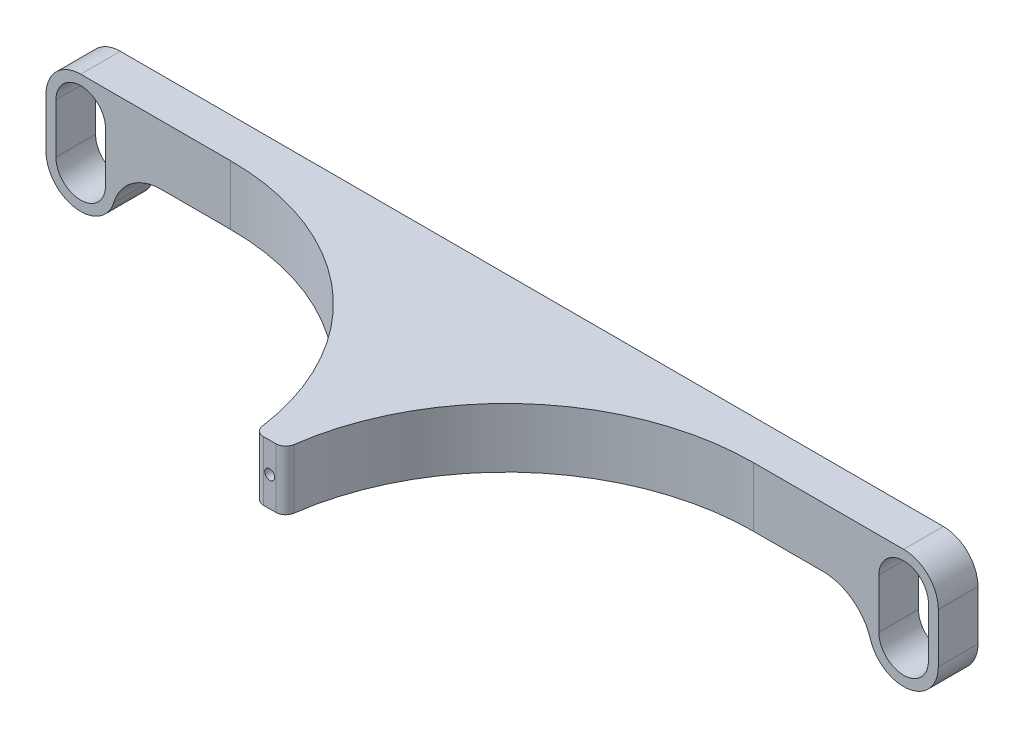
ISO-10303-21;
HEADER;
FILE_DESCRIPTION(('STEP AP214'),'2;1');
FILE_NAME('part.step','',(''),(''),'','','');
FILE_SCHEMA(('AUTOMOTIVE_DESIGN { 1 0 10303 214 1 1 1 1 }'));
ENDSEC;
DATA;
#1=APPLICATION_CONTEXT('core data for automotive mechanical design processes');
#2=APPLICATION_PROTOCOL_DEFINITION('international standard','automotive_design',2000,#1);
#3=PRODUCT_CONTEXT('',#1,'mechanical');
#4=PRODUCT('Part','Part','',(#3));
#5=PRODUCT_RELATED_PRODUCT_CATEGORY('part','',(#4));
#6=PRODUCT_DEFINITION_FORMATION('','',#4);
#7=PRODUCT_DEFINITION_CONTEXT('part definition',#1,'design');
#8=PRODUCT_DEFINITION('design','',#6,#7);
#9=PRODUCT_DEFINITION_SHAPE('','',#8);
#10=(LENGTH_UNIT() NAMED_UNIT(*) SI_UNIT(.MILLI.,.METRE.));
#11=(NAMED_UNIT(*) PLANE_ANGLE_UNIT() SI_UNIT($,.RADIAN.));
#12=(NAMED_UNIT(*) SI_UNIT($,.STERADIAN.) SOLID_ANGLE_UNIT());
#13=UNCERTAINTY_MEASURE_WITH_UNIT(LENGTH_MEASURE(1.E-05),#10,'distance_accuracy_value','');
#14=(GEOMETRIC_REPRESENTATION_CONTEXT(3) GLOBAL_UNCERTAINTY_ASSIGNED_CONTEXT((#13)) GLOBAL_UNIT_ASSIGNED_CONTEXT((#10,
#11,#12)) REPRESENTATION_CONTEXT('',''));
#15=CARTESIAN_POINT('',(0.,0.,0.));
#16=DIRECTION('',(0.,0.,1.));
#17=DIRECTION('',(1.,0.,0.));
#18=AXIS2_PLACEMENT_3D('',#15,#16,#17);
#19=CARTESIAN_POINT('',(0.,0.,4.));
#20=DIRECTION('',(0.,0.,1.));
#21=DIRECTION('',(1.,0.,0.));
#22=AXIS2_PLACEMENT_3D('',#19,#20,#21);
#23=PLANE('',#22);
#24=DIRECTION('',(1.,0.,0.));
#25=VECTOR('',#24,1.);
#26=CARTESIAN_POINT('',(0.,-6.,4.));
#27=LINE('',#26,#25);
#28=CARTESIAN_POINT('',(-33.375961595364,-6.,4.));
#29=VERTEX_POINT('',#28);
#30=CARTESIAN_POINT('',(-26.3685825892832,-6.,4.));
#31=VERTEX_POINT('',#30);
#32=EDGE_CURVE('E226',#29,#31,#27,.T.);
#33=ORIENTED_EDGE('',*,*,#32,.T.);
#34=DIRECTION('',(0.,1.,0.));
#35=VECTOR('',#34,1.);
#36=CARTESIAN_POINT('',(-26.3685825892832,0.,4.));
#37=LINE('',#36,#35);
#38=CARTESIAN_POINT('',(-26.3685825892832,0.,4.));
#39=VERTEX_POINT('',#38);
#40=EDGE_CURVE('E363',#31,#39,#37,.T.);
#41=ORIENTED_EDGE('',*,*,#40,.T.);
#42=DIRECTION('',(1.,0.,0.));
#43=VECTOR('',#42,1.);
#44=CARTESIAN_POINT('',(0.,0.,4.));
#45=LINE('',#44,#43);
#46=CARTESIAN_POINT('',(-41.5,0.,4.));
#47=VERTEX_POINT('',#46);
#48=EDGE_CURVE('E240',#47,#39,#45,.T.);
#49=ORIENTED_EDGE('',*,*,#48,.F.);
#50=CARTESIAN_POINT('',(-41.5,-3.5,4.));
#51=DIRECTION('',(0.,0.,1.));
#52=DIRECTION('',(1.,0.,0.));
#53=AXIS2_PLACEMENT_3D('',#50,#51,#52);
#54=CIRCLE('',#53,3.5);
#55=CARTESIAN_POINT('',(-45.,-3.5,4.));
#56=VERTEX_POINT('',#55);
#57=EDGE_CURVE('E239',#47,#56,#54,.T.);
#58=ORIENTED_EDGE('',*,*,#57,.T.);
#59=DIRECTION('',(0.,-1.,0.));
#60=VECTOR('',#59,1.);
#61=CARTESIAN_POINT('',(-45.,0.,4.));
#62=LINE('',#61,#60);
#63=CARTESIAN_POINT('',(-45.,-8.5,4.));
#64=VERTEX_POINT('',#63);
#65=EDGE_CURVE('E245',#56,#64,#62,.T.);
#66=ORIENTED_EDGE('',*,*,#65,.T.);
#67=CARTESIAN_POINT('',(-41.5,-8.5,4.));
#68=DIRECTION('',(0.,0.,1.));
#69=DIRECTION('',(1.,0.,0.));
#70=AXIS2_PLACEMENT_3D('',#67,#68,#69);
#71=CIRCLE('',#70,3.5);
#72=CARTESIAN_POINT('',(-38.1548077157381,-9.52941176470588,4.));
#73=VERTEX_POINT('',#72);
#74=EDGE_CURVE('E242',#64,#73,#71,.T.);
#75=ORIENTED_EDGE('',*,*,#74,.T.);
#76=CARTESIAN_POINT('',(-33.375961595364,-11.,4.));
#77=DIRECTION('',(0.,0.,1.));
#78=DIRECTION('',(1.,0.,0.));
#79=AXIS2_PLACEMENT_3D('',#76,#77,#78);
#80=CIRCLE('',#79,5.);
#81=EDGE_CURVE('E357',#73,#29,#80,.F.);
#82=ORIENTED_EDGE('',*,*,#81,.T.);
#83=EDGE_LOOP('',(#33,#41,#49,#58,#66,#75,#82));
#84=FACE_BOUND('',#83,.T.);
#85=CARTESIAN_POINT('',(-41.5,-8.5,4.));
#86=DIRECTION('',(0.,0.,1.));
#87=DIRECTION('',(1.,0.,0.));
#88=AXIS2_PLACEMENT_3D('',#85,#86,#87);
#89=CIRCLE('',#88,2.5);
#90=CARTESIAN_POINT('',(-44.,-8.5,4.));
#91=VERTEX_POINT('',#90);
#92=CARTESIAN_POINT('',(-39.,-8.5,4.));
#93=VERTEX_POINT('',#92);
#94=EDGE_CURVE('E250',#91,#93,#89,.T.);
#95=ORIENTED_EDGE('',*,*,#94,.F.);
#96=DIRECTION('',(0.,-1.,0.));
#97=VECTOR('',#96,1.);
#98=CARTESIAN_POINT('',(-44.,0.,4.));
#99=LINE('',#98,#97);
#100=CARTESIAN_POINT('',(-44.,-3.5,4.));
#101=VERTEX_POINT('',#100);
#102=EDGE_CURVE('E249',#101,#91,#99,.T.);
#103=ORIENTED_EDGE('',*,*,#102,.F.);
#104=CARTESIAN_POINT('',(-41.5,-3.5,4.));
#105=DIRECTION('',(0.,0.,1.));
#106=DIRECTION('',(1.,0.,0.));
#107=AXIS2_PLACEMENT_3D('',#104,#105,#106);
#108=CIRCLE('',#107,2.5);
#109=CARTESIAN_POINT('',(-39.,-3.5,4.));
#110=VERTEX_POINT('',#109);
#111=EDGE_CURVE('E254',#110,#101,#108,.T.);
#112=ORIENTED_EDGE('',*,*,#111,.F.);
#113=DIRECTION('',(0.,-1.,0.));
#114=VECTOR('',#113,1.);
#115=CARTESIAN_POINT('',(-39.,0.,4.));
#116=LINE('',#115,#114);
#117=EDGE_CURVE('E257',#110,#93,#116,.T.);
#118=ORIENTED_EDGE('',*,*,#117,.T.);
#119=EDGE_LOOP('',(#95,#103,#112,#118));
#120=FACE_BOUND('',#119,.T.);
#121=ADVANCED_FACE('F41',(#84,#120),#23,.T.);
#122=CARTESIAN_POINT('',(39.,0.,4.));
#123=DIRECTION('',(1.,0.,0.));
#124=DIRECTION('',(0.,0.,-1.));
#125=AXIS2_PLACEMENT_3D('',#122,#123,#124);
#126=PLANE('',#125);
#127=DIRECTION('',(0.,-1.,0.));
#128=VECTOR('',#127,1.);
#129=CARTESIAN_POINT('',(39.,0.,0.));
#130=LINE('',#129,#128);
#131=CARTESIAN_POINT('',(39.,-3.5,0.));
#132=VERTEX_POINT('',#131);
#133=CARTESIAN_POINT('',(39.,-8.5,0.));
#134=VERTEX_POINT('',#133);
#135=EDGE_CURVE('E305',#132,#134,#130,.T.);
#136=ORIENTED_EDGE('',*,*,#135,.F.);
#137=DIRECTION('',(0.,0.,-1.));
#138=VECTOR('',#137,1.);
#139=CARTESIAN_POINT('',(39.,-3.5,4.));
#140=LINE('',#139,#138);
#141=CARTESIAN_POINT('',(39.,-3.5,4.));
#142=VERTEX_POINT('',#141);
#143=EDGE_CURVE('E321',#142,#132,#140,.T.);
#144=ORIENTED_EDGE('',*,*,#143,.F.);
#145=DIRECTION('',(0.,-1.,0.));
#146=VECTOR('',#145,1.);
#147=CARTESIAN_POINT('',(39.,0.,4.));
#148=LINE('',#147,#146);
#149=CARTESIAN_POINT('',(39.,-8.5,4.));
#150=VERTEX_POINT('',#149);
#151=EDGE_CURVE('E259',#142,#150,#148,.T.);
#152=ORIENTED_EDGE('',*,*,#151,.T.);
#153=DIRECTION('',(0.,0.,-1.));
#154=VECTOR('',#153,1.);
#155=CARTESIAN_POINT('',(39.,-8.5,4.));
#156=LINE('',#155,#154);
#157=EDGE_CURVE('E314',#150,#134,#156,.T.);
#158=ORIENTED_EDGE('',*,*,#157,.T.);
#159=EDGE_LOOP('',(#136,#144,#152,#158));
#160=FACE_BOUND('',#159,.T.);
#161=ADVANCED_FACE('F434',(#160),#126,.T.);
#162=CARTESIAN_POINT('',(41.5,-3.5,4.));
#163=DIRECTION('',(0.,0.,-1.));
#164=DIRECTION('',(-1.,0.,0.));
#165=AXIS2_PLACEMENT_3D('',#162,#163,#164);
#166=CYLINDRICAL_SURFACE('',#165,2.5);
#167=CARTESIAN_POINT('',(41.5,-3.5,0.));
#168=DIRECTION('',(0.,0.,1.));
#169=DIRECTION('',(1.,0.,0.));
#170=AXIS2_PLACEMENT_3D('',#167,#168,#169);
#171=CIRCLE('',#170,2.5);
#172=CARTESIAN_POINT('',(44.,-3.5,0.));
#173=VERTEX_POINT('',#172);
#174=EDGE_CURVE('E304',#132,#173,#171,.F.);
#175=ORIENTED_EDGE('',*,*,#174,.T.);
#176=DIRECTION('',(0.,0.,-1.));
#177=VECTOR('',#176,1.);
#178=CARTESIAN_POINT('',(44.,-3.5,4.));
#179=LINE('',#178,#177);
#180=CARTESIAN_POINT('',(44.,-3.5,4.));
#181=VERTEX_POINT('',#180);
#182=EDGE_CURVE('E322',#181,#173,#179,.T.);
#183=ORIENTED_EDGE('',*,*,#182,.F.);
#184=CARTESIAN_POINT('',(41.5,-3.5,4.));
#185=DIRECTION('',(0.,0.,1.));
#186=DIRECTION('',(1.,0.,0.));
#187=AXIS2_PLACEMENT_3D('',#184,#185,#186);
#188=CIRCLE('',#187,2.5);
#189=EDGE_CURVE('E263',#142,#181,#188,.F.);
#190=ORIENTED_EDGE('',*,*,#189,.F.);
#191=ORIENTED_EDGE('',*,*,#143,.T.);
#192=EDGE_LOOP('',(#175,#183,#190,#191));
#193=FACE_BOUND('',#192,.T.);
#194=ADVANCED_FACE('F441',(#193),#166,.F.);
#195=CARTESIAN_POINT('',(44.,0.,4.));
#196=DIRECTION('',(1.,0.,0.));
#197=DIRECTION('',(0.,0.,-1.));
#198=AXIS2_PLACEMENT_3D('',#195,#196,#197);
#199=PLANE('',#198);
#200=DIRECTION('',(0.,-1.,0.));
#201=VECTOR('',#200,1.);
#202=CARTESIAN_POINT('',(44.,0.,0.));
#203=LINE('',#202,#201);
#204=CARTESIAN_POINT('',(44.,-8.5,0.));
#205=VERTEX_POINT('',#204);
#206=EDGE_CURVE('E308',#173,#205,#203,.T.);
#207=ORIENTED_EDGE('',*,*,#206,.T.);
#208=DIRECTION('',(0.,0.,-1.));
#209=VECTOR('',#208,1.);
#210=CARTESIAN_POINT('',(44.,-8.5,4.));
#211=LINE('',#210,#209);
#212=CARTESIAN_POINT('',(44.,-8.5,4.));
#213=VERTEX_POINT('',#212);
#214=EDGE_CURVE('E320',#213,#205,#211,.T.);
#215=ORIENTED_EDGE('',*,*,#214,.F.);
#216=DIRECTION('',(0.,-1.,0.));
#217=VECTOR('',#216,1.);
#218=CARTESIAN_POINT('',(44.,0.,4.));
#219=LINE('',#218,#217);
#220=EDGE_CURVE('E264',#181,#213,#219,.T.);
#221=ORIENTED_EDGE('',*,*,#220,.F.);
#222=ORIENTED_EDGE('',*,*,#182,.T.);
#223=EDGE_LOOP('',(#207,#215,#221,#222));
#224=FACE_BOUND('',#223,.T.);
#225=ADVANCED_FACE('F463',(#224),#199,.F.);
#226=CARTESIAN_POINT('',(-41.5,-8.5,4.));
#227=DIRECTION('',(0.,0.,-1.));
#228=DIRECTION('',(-1.,0.,0.));
#229=AXIS2_PLACEMENT_3D('',#226,#227,#228);
#230=CYLINDRICAL_SURFACE('',#229,2.5);
#231=CARTESIAN_POINT('',(-41.5,-8.5,0.));
#232=DIRECTION('',(0.,0.,1.));
#233=DIRECTION('',(1.,0.,0.));
#234=AXIS2_PLACEMENT_3D('',#231,#232,#233);
#235=CIRCLE('',#234,2.5);
#236=CARTESIAN_POINT('',(-44.,-8.5,0.));
#237=VERTEX_POINT('',#236);
#238=CARTESIAN_POINT('',(-39.,-8.5,0.));
#239=VERTEX_POINT('',#238);
#240=EDGE_CURVE('E287',#237,#239,#235,.T.);
#241=ORIENTED_EDGE('',*,*,#240,.F.);
#242=DIRECTION('',(0.,0.,-1.));
#243=VECTOR('',#242,1.);
#244=CARTESIAN_POINT('',(-44.,-8.5,4.));
#245=LINE('',#244,#243);
#246=EDGE_CURVE('E319',#91,#237,#245,.T.);
#247=ORIENTED_EDGE('',*,*,#246,.F.);
#248=ORIENTED_EDGE('',*,*,#94,.T.);
#249=DIRECTION('',(0.,0.,-1.));
#250=VECTOR('',#249,1.);
#251=CARTESIAN_POINT('',(-39.,-8.5,4.));
#252=LINE('',#251,#250);
#253=EDGE_CURVE('E213',#93,#239,#252,.T.);
#254=ORIENTED_EDGE('',*,*,#253,.T.);
#255=EDGE_LOOP('',(#241,#247,#248,#254));
#256=FACE_BOUND('',#255,.T.);
#257=ADVANCED_FACE('F470',(#256),#230,.F.);
#258=CARTESIAN_POINT('',(-44.,0.,4.));
#259=DIRECTION('',(1.,0.,0.));
#260=DIRECTION('',(0.,0.,-1.));
#261=AXIS2_PLACEMENT_3D('',#258,#259,#260);
#262=PLANE('',#261);
#263=DIRECTION('',(0.,-1.,0.));
#264=VECTOR('',#263,1.);
#265=CARTESIAN_POINT('',(-44.,0.,0.));
#266=LINE('',#265,#264);
#267=CARTESIAN_POINT('',(-44.,-3.5,0.));
#268=VERTEX_POINT('',#267);
#269=EDGE_CURVE('E291',#268,#237,#266,.T.);
#270=ORIENTED_EDGE('',*,*,#269,.F.);
#271=DIRECTION('',(0.,0.,-1.));
#272=VECTOR('',#271,1.);
#273=CARTESIAN_POINT('',(-44.,-3.5,4.));
#274=LINE('',#273,#272);
#275=EDGE_CURVE('E327',#101,#268,#274,.T.);
#276=ORIENTED_EDGE('',*,*,#275,.F.);
#277=ORIENTED_EDGE('',*,*,#102,.T.);
#278=ORIENTED_EDGE('',*,*,#246,.T.);
#279=EDGE_LOOP('',(#270,#276,#277,#278));
#280=FACE_BOUND('',#279,.T.);
#281=ADVANCED_FACE('F473',(#280),#262,.T.);
#282=CARTESIAN_POINT('',(-41.5,-3.5,4.));
#283=DIRECTION('',(0.,0.,-1.));
#284=DIRECTION('',(-1.,0.,0.));
#285=AXIS2_PLACEMENT_3D('',#282,#283,#284);
#286=CYLINDRICAL_SURFACE('',#285,2.5);
#287=CARTESIAN_POINT('',(-41.5,-3.5,0.));
#288=DIRECTION('',(0.,0.,1.));
#289=DIRECTION('',(1.,0.,0.));
#290=AXIS2_PLACEMENT_3D('',#287,#288,#289);
#291=CIRCLE('',#290,2.5);
#292=CARTESIAN_POINT('',(-39.,-3.5,0.));
#293=VERTEX_POINT('',#292);
#294=EDGE_CURVE('E298',#293,#268,#291,.T.);
#295=ORIENTED_EDGE('',*,*,#294,.F.);
#296=DIRECTION('',(0.,0.,-1.));
#297=VECTOR('',#296,1.);
#298=CARTESIAN_POINT('',(-39.,-3.5,4.));
#299=LINE('',#298,#297);
#300=EDGE_CURVE('E326',#110,#293,#299,.T.);
#301=ORIENTED_EDGE('',*,*,#300,.F.);
#302=ORIENTED_EDGE('',*,*,#111,.T.);
#303=ORIENTED_EDGE('',*,*,#275,.T.);
#304=EDGE_LOOP('',(#295,#301,#302,#303));
#305=FACE_BOUND('',#304,.T.);
#306=ADVANCED_FACE('F475',(#305),#286,.F.);
#307=CARTESIAN_POINT('',(0.,-6.,4.));
#308=DIRECTION('',(0.,1.,0.));
#309=DIRECTION('',(0.,0.,1.));
#310=AXIS2_PLACEMENT_3D('',#307,#308,#309);
#311=PLANE('',#310);
#312=CARTESIAN_POINT('',(26.3685825892832,-6.,29.));
#313=DIRECTION('',(0.,1.,0.));
#314=DIRECTION('',(0.,0.,1.));
#315=AXIS2_PLACEMENT_3D('',#312,#313,#314);
#316=CIRCLE('',#315,25.);
#317=CARTESIAN_POINT('',(26.3685825892832,-6.,4.));
#318=VERTEX_POINT('',#317);
#319=CARTESIAN_POINT('',(1.60404051036122,-6.,25.5769230769231));
#320=VERTEX_POINT('',#319);
#321=EDGE_CURVE('E362',#318,#320,#316,.T.);
#322=ORIENTED_EDGE('',*,*,#321,.T.);
#323=CARTESIAN_POINT('',(0.613458827204334,-6.,25.44));
#324=DIRECTION('',(0.,1.,0.));
#325=DIRECTION('',(0.,0.,1.));
#326=AXIS2_PLACEMENT_3D('',#323,#324,#325);
#327=CIRCLE('',#326,1.);
#328=CARTESIAN_POINT('',(0.613458827204334,-6.,26.44));
#329=VERTEX_POINT('',#328);
#330=EDGE_CURVE('E47',#320,#329,#327,.F.);
#331=ORIENTED_EDGE('',*,*,#330,.T.);
#332=DIRECTION('',(1.,0.,0.));
#333=VECTOR('',#332,1.);
#334=CARTESIAN_POINT('',(-1.5,-6.,26.44));
#335=LINE('',#334,#333);
#336=CARTESIAN_POINT('',(-0.61345882720433,-6.,26.44));
#337=VERTEX_POINT('',#336);
#338=EDGE_CURVE('E387',#337,#329,#335,.T.);
#339=ORIENTED_EDGE('',*,*,#338,.F.);
#340=CARTESIAN_POINT('',(-0.61345882720433,-6.,25.44));
#341=DIRECTION('',(0.,1.,0.));
#342=DIRECTION('',(0.,0.,1.));
#343=AXIS2_PLACEMENT_3D('',#340,#341,#342);
#344=CIRCLE('',#343,1.);
#345=CARTESIAN_POINT('',(-1.60404051036121,-6.,25.5769230769231));
#346=VERTEX_POINT('',#345);
#347=EDGE_CURVE('E57',#337,#346,#344,.F.);
#348=ORIENTED_EDGE('',*,*,#347,.T.);
#349=CARTESIAN_POINT('',(-26.3685825892832,-6.,29.));
#350=DIRECTION('',(0.,1.,0.));
#351=DIRECTION('',(0.,0.,1.));
#352=AXIS2_PLACEMENT_3D('',#349,#350,#351);
#353=CIRCLE('',#352,25.);
#354=EDGE_CURVE('E370',#346,#31,#353,.T.);
#355=ORIENTED_EDGE('',*,*,#354,.T.);
#356=ORIENTED_EDGE('',*,*,#32,.F.);
#357=DIRECTION('',(0.,0.,1.));
#358=VECTOR('',#357,1.);
#359=CARTESIAN_POINT('',(-33.375961595364,-6.,0.));
#360=LINE('',#359,#358);
#361=CARTESIAN_POINT('',(-33.375961595364,-6.,0.));
#362=VERTEX_POINT('',#361);
#363=EDGE_CURVE('E341',#29,#362,#360,.F.);
#364=ORIENTED_EDGE('',*,*,#363,.T.);
#365=DIRECTION('',(1.,0.,0.));
#366=VECTOR('',#365,1.);
#367=CARTESIAN_POINT('',(0.,-6.,0.));
#368=LINE('',#367,#366);
#369=CARTESIAN_POINT('',(33.375961595364,-6.,0.));
#370=VERTEX_POINT('',#369);
#371=EDGE_CURVE('E267',#362,#370,#368,.T.);
#372=ORIENTED_EDGE('',*,*,#371,.T.);
#373=DIRECTION('',(0.,0.,-1.));
#374=VECTOR('',#373,1.);
#375=CARTESIAN_POINT('',(33.375961595364,-6.,4.));
#376=LINE('',#375,#374);
#377=CARTESIAN_POINT('',(33.375961595364,-6.,4.));
#378=VERTEX_POINT('',#377);
#379=EDGE_CURVE('E350',#370,#378,#376,.F.);
#380=ORIENTED_EDGE('',*,*,#379,.T.);
#381=EDGE_CURVE('E313',#318,#378,#27,.T.);
#382=ORIENTED_EDGE('',*,*,#381,.F.);
#383=EDGE_LOOP('',(#322,#331,#339,#348,#355,#356,#364,#372,#380,#382));
#384=FACE_BOUND('',#383,.T.);
#385=ADVANCED_FACE('F383',(#384),#311,.F.);
#386=CARTESIAN_POINT('',(41.5,-8.5,4.));
#387=DIRECTION('',(0.,0.,-1.));
#388=DIRECTION('',(-1.,0.,0.));
#389=AXIS2_PLACEMENT_3D('',#386,#387,#388);
#390=CYLINDRICAL_SURFACE('',#389,3.5);
#391=CARTESIAN_POINT('',(41.5,-8.5,4.));
#392=DIRECTION('',(0.,0.,1.));
#393=DIRECTION('',(1.,0.,0.));
#394=AXIS2_PLACEMENT_3D('',#391,#392,#393);
#395=CIRCLE('',#394,3.5);
#396=CARTESIAN_POINT('',(45.,-8.5,4.));
#397=VERTEX_POINT('',#396);
#398=CARTESIAN_POINT('',(38.1548077157381,-9.52941176470588,4.));
#399=VERTEX_POINT('',#398);
#400=EDGE_CURVE('E210',#397,#399,#395,.F.);
#401=ORIENTED_EDGE('',*,*,#400,.T.);
#402=DIRECTION('',(0.,0.,-1.));
#403=VECTOR('',#402,1.);
#404=CARTESIAN_POINT('',(38.1548077157381,-9.52941176470588,4.));
#405=LINE('',#404,#403);
#406=CARTESIAN_POINT('',(38.1548077157381,-9.52941176470588,0.));
#407=VERTEX_POINT('',#406);
#408=EDGE_CURVE('E328',#399,#407,#405,.T.);
#409=ORIENTED_EDGE('',*,*,#408,.T.);
#410=CARTESIAN_POINT('',(41.5,-8.5,0.));
#411=DIRECTION('',(0.,0.,1.));
#412=DIRECTION('',(1.,0.,0.));
#413=AXIS2_PLACEMENT_3D('',#410,#411,#412);
#414=CIRCLE('',#413,3.5);
#415=CARTESIAN_POINT('',(45.,-8.5,0.));
#416=VERTEX_POINT('',#415);
#417=EDGE_CURVE('E208',#416,#407,#414,.F.);
#418=ORIENTED_EDGE('',*,*,#417,.F.);
#419=DIRECTION('',(0.,0.,-1.));
#420=VECTOR('',#419,1.);
#421=CARTESIAN_POINT('',(45.,-8.5,4.));
#422=LINE('',#421,#420);
#423=EDGE_CURVE('E205',#397,#416,#422,.T.);
#424=ORIENTED_EDGE('',*,*,#423,.F.);
#425=EDGE_LOOP('',(#401,#409,#418,#424));
#426=FACE_BOUND('',#425,.T.);
#427=ADVANCED_FACE('F202',(#426),#390,.T.);
#428=CARTESIAN_POINT('',(45.,0.,4.));
#429=DIRECTION('',(1.,0.,0.));
#430=DIRECTION('',(0.,0.,-1.));
#431=AXIS2_PLACEMENT_3D('',#428,#429,#430);
#432=PLANE('',#431);
#433=DIRECTION('',(0.,-1.,0.));
#434=VECTOR('',#433,1.);
#435=CARTESIAN_POINT('',(45.,0.,0.));
#436=LINE('',#435,#434);
#437=CARTESIAN_POINT('',(45.,-3.5,0.));
#438=VERTEX_POINT('',#437);
#439=EDGE_CURVE('E273',#438,#416,#436,.T.);
#440=ORIENTED_EDGE('',*,*,#439,.F.);
#441=DIRECTION('',(0.,0.,-1.));
#442=VECTOR('',#441,1.);
#443=CARTESIAN_POINT('',(45.,-3.5,4.));
#444=LINE('',#443,#442);
#445=CARTESIAN_POINT('',(45.,-3.5,4.));
#446=VERTEX_POINT('',#445);
#447=EDGE_CURVE('E218',#446,#438,#444,.T.);
#448=ORIENTED_EDGE('',*,*,#447,.F.);
#449=DIRECTION('',(0.,-1.,0.));
#450=VECTOR('',#449,1.);
#451=CARTESIAN_POINT('',(45.,0.,4.));
#452=LINE('',#451,#450);
#453=EDGE_CURVE('E223',#446,#397,#452,.T.);
#454=ORIENTED_EDGE('',*,*,#453,.T.);
#455=ORIENTED_EDGE('',*,*,#423,.T.);
#456=EDGE_LOOP('',(#440,#448,#454,#455));
#457=FACE_BOUND('',#456,.T.);
#458=ADVANCED_FACE('F229',(#457),#432,.T.);
#459=CARTESIAN_POINT('',(41.5,-3.5,4.));
#460=DIRECTION('',(0.,0.,-1.));
#461=DIRECTION('',(-1.,0.,0.));
#462=AXIS2_PLACEMENT_3D('',#459,#460,#461);
#463=CYLINDRICAL_SURFACE('',#462,3.5);
#464=CARTESIAN_POINT('',(41.5,-3.5,0.));
#465=DIRECTION('',(0.,0.,1.));
#466=DIRECTION('',(1.,0.,0.));
#467=AXIS2_PLACEMENT_3D('',#464,#465,#466);
#468=CIRCLE('',#467,3.5);
#469=CARTESIAN_POINT('',(41.5,0.,0.));
#470=VERTEX_POINT('',#469);
#471=EDGE_CURVE('E280',#470,#438,#468,.F.);
#472=ORIENTED_EDGE('',*,*,#471,.F.);
#473=DIRECTION('',(0.,0.,-1.));
#474=VECTOR('',#473,1.);
#475=CARTESIAN_POINT('',(41.5,0.,4.));
#476=LINE('',#475,#474);
#477=CARTESIAN_POINT('',(41.5,0.,4.));
#478=VERTEX_POINT('',#477);
#479=EDGE_CURVE('E338',#478,#470,#476,.T.);
#480=ORIENTED_EDGE('',*,*,#479,.F.);
#481=CARTESIAN_POINT('',(41.5,-3.5,4.));
#482=DIRECTION('',(0.,0.,1.));
#483=DIRECTION('',(1.,0.,0.));
#484=AXIS2_PLACEMENT_3D('',#481,#482,#483);
#485=CIRCLE('',#484,3.5);
#486=EDGE_CURVE('E233',#478,#446,#485,.F.);
#487=ORIENTED_EDGE('',*,*,#486,.T.);
#488=ORIENTED_EDGE('',*,*,#447,.T.);
#489=EDGE_LOOP('',(#472,#480,#487,#488));
#490=FACE_BOUND('',#489,.T.);
#491=ADVANCED_FACE('F492',(#490),#463,.T.);
#492=CARTESIAN_POINT('',(0.,0.,4.));
#493=DIRECTION('',(0.,1.,0.));
#494=DIRECTION('',(0.,0.,1.));
#495=AXIS2_PLACEMENT_3D('',#492,#493,#494);
#496=PLANE('',#495);
#497=DIRECTION('',(-1.,0.,0.));
#498=VECTOR('',#497,1.);
#499=CARTESIAN_POINT('',(1.5,0.,26.44));
#500=LINE('',#499,#498);
#501=CARTESIAN_POINT('',(0.613458827204334,0.,26.44));
#502=VERTEX_POINT('',#501);
#503=CARTESIAN_POINT('',(-0.613458827204333,0.,26.44));
#504=VERTEX_POINT('',#503);
#505=EDGE_CURVE('E271',#502,#504,#500,.T.);
#506=ORIENTED_EDGE('',*,*,#505,.F.);
#507=CARTESIAN_POINT('',(0.613458827204334,0.,25.44));
#508=DIRECTION('',(0.,1.,0.));
#509=DIRECTION('',(0.,0.,1.));
#510=AXIS2_PLACEMENT_3D('',#507,#508,#509);
#511=CIRCLE('',#510,1.);
#512=CARTESIAN_POINT('',(1.60404051036122,0.,25.5769230769231));
#513=VERTEX_POINT('',#512);
#514=EDGE_CURVE('E379',#502,#513,#511,.T.);
#515=ORIENTED_EDGE('',*,*,#514,.T.);
#516=CARTESIAN_POINT('',(26.3685825892832,0.,29.));
#517=DIRECTION('',(0.,1.,0.));
#518=DIRECTION('',(0.,0.,1.));
#519=AXIS2_PLACEMENT_3D('',#516,#517,#518);
#520=CIRCLE('',#519,25.);
#521=CARTESIAN_POINT('',(26.3685825892832,0.,4.));
#522=VERTEX_POINT('',#521);
#523=EDGE_CURVE('E361',#513,#522,#520,.F.);
#524=ORIENTED_EDGE('',*,*,#523,.T.);
#525=EDGE_CURVE('E231',#522,#478,#45,.T.);
#526=ORIENTED_EDGE('',*,*,#525,.T.);
#527=ORIENTED_EDGE('',*,*,#479,.T.);
#528=DIRECTION('',(1.,0.,0.));
#529=VECTOR('',#528,1.);
#530=CARTESIAN_POINT('',(0.,0.,0.));
#531=LINE('',#530,#529);
#532=CARTESIAN_POINT('',(-41.5,0.,0.));
#533=VERTEX_POINT('',#532);
#534=EDGE_CURVE('E278',#533,#470,#531,.T.);
#535=ORIENTED_EDGE('',*,*,#534,.F.);
#536=DIRECTION('',(0.,0.,-1.));
#537=VECTOR('',#536,1.);
#538=CARTESIAN_POINT('',(-41.5,0.,4.));
#539=LINE('',#538,#537);
#540=EDGE_CURVE('E336',#47,#533,#539,.T.);
#541=ORIENTED_EDGE('',*,*,#540,.F.);
#542=ORIENTED_EDGE('',*,*,#48,.T.);
#543=CARTESIAN_POINT('',(-26.3685825892832,0.,29.));
#544=DIRECTION('',(0.,1.,0.));
#545=DIRECTION('',(0.,0.,1.));
#546=AXIS2_PLACEMENT_3D('',#543,#544,#545);
#547=CIRCLE('',#546,25.);
#548=CARTESIAN_POINT('',(-1.60404051036122,0.,25.5769230769231));
#549=VERTEX_POINT('',#548);
#550=EDGE_CURVE('E367',#39,#549,#547,.F.);
#551=ORIENTED_EDGE('',*,*,#550,.T.);
#552=CARTESIAN_POINT('',(-0.613458827204334,0.,25.44));
#553=DIRECTION('',(0.,1.,0.));
#554=DIRECTION('',(0.,0.,1.));
#555=AXIS2_PLACEMENT_3D('',#552,#553,#554);
#556=CIRCLE('',#555,1.);
#557=EDGE_CURVE('E377',#549,#504,#556,.T.);
#558=ORIENTED_EDGE('',*,*,#557,.T.);
#559=EDGE_LOOP('',(#506,#515,#524,#526,#527,#535,#541,#542,#551,#558));
#560=FACE_BOUND('',#559,.T.);
#561=ADVANCED_FACE('F398',(#560),#496,.T.);
#562=CARTESIAN_POINT('',(-41.5,-3.5,4.));
#563=DIRECTION('',(0.,0.,-1.));
#564=DIRECTION('',(-1.,0.,0.));
#565=AXIS2_PLACEMENT_3D('',#562,#563,#564);
#566=CYLINDRICAL_SURFACE('',#565,3.5);
#567=CARTESIAN_POINT('',(-41.5,-3.5,0.));
#568=DIRECTION('',(0.,0.,1.));
#569=DIRECTION('',(1.,0.,0.));
#570=AXIS2_PLACEMENT_3D('',#567,#568,#569);
#571=CIRCLE('',#570,3.5);
#572=CARTESIAN_POINT('',(-45.,-3.5,0.));
#573=VERTEX_POINT('',#572);
#574=EDGE_CURVE('E281',#533,#573,#571,.T.);
#575=ORIENTED_EDGE('',*,*,#574,.T.);
#576=DIRECTION('',(0.,0.,-1.));
#577=VECTOR('',#576,1.);
#578=CARTESIAN_POINT('',(-45.,-3.5,4.));
#579=LINE('',#578,#577);
#580=EDGE_CURVE('E332',#56,#573,#579,.T.);
#581=ORIENTED_EDGE('',*,*,#580,.F.);
#582=ORIENTED_EDGE('',*,*,#57,.F.);
#583=ORIENTED_EDGE('',*,*,#540,.T.);
#584=EDGE_LOOP('',(#575,#581,#582,#583));
#585=FACE_BOUND('',#584,.T.);
#586=ADVANCED_FACE('F490',(#585),#566,.T.);
#587=CARTESIAN_POINT('',(-45.,0.,4.));
#588=DIRECTION('',(1.,0.,0.));
#589=DIRECTION('',(0.,0.,-1.));
#590=AXIS2_PLACEMENT_3D('',#587,#588,#589);
#591=PLANE('',#590);
#592=DIRECTION('',(0.,-1.,0.));
#593=VECTOR('',#592,1.);
#594=CARTESIAN_POINT('',(-45.,0.,0.));
#595=LINE('',#594,#593);
#596=CARTESIAN_POINT('',(-45.,-8.5,0.));
#597=VERTEX_POINT('',#596);
#598=EDGE_CURVE('E282',#573,#597,#595,.T.);
#599=ORIENTED_EDGE('',*,*,#598,.T.);
#600=DIRECTION('',(0.,0.,-1.));
#601=VECTOR('',#600,1.);
#602=CARTESIAN_POINT('',(-45.,-8.5,4.));
#603=LINE('',#602,#601);
#604=EDGE_CURVE('E268',#64,#597,#603,.T.);
#605=ORIENTED_EDGE('',*,*,#604,.F.);
#606=ORIENTED_EDGE('',*,*,#65,.F.);
#607=ORIENTED_EDGE('',*,*,#580,.T.);
#608=EDGE_LOOP('',(#599,#605,#606,#607));
#609=FACE_BOUND('',#608,.T.);
#610=ADVANCED_FACE('F482',(#609),#591,.F.);
#611=CARTESIAN_POINT('',(-41.5,-8.5,4.));
#612=DIRECTION('',(0.,0.,-1.));
#613=DIRECTION('',(-1.,0.,0.));
#614=AXIS2_PLACEMENT_3D('',#611,#612,#613);
#615=CYLINDRICAL_SURFACE('',#614,3.5);
#616=CARTESIAN_POINT('',(-41.5,-8.5,0.));
#617=DIRECTION('',(0.,0.,1.));
#618=DIRECTION('',(1.,0.,0.));
#619=AXIS2_PLACEMENT_3D('',#616,#617,#618);
#620=CIRCLE('',#619,3.5);
#621=CARTESIAN_POINT('',(-38.1548077157381,-9.52941176470588,0.));
#622=VERTEX_POINT('',#621);
#623=EDGE_CURVE('E286',#597,#622,#620,.T.);
#624=ORIENTED_EDGE('',*,*,#623,.T.);
#625=DIRECTION('',(0.,0.,-1.));
#626=VECTOR('',#625,1.);
#627=CARTESIAN_POINT('',(-38.1548077157381,-9.52941176470588,4.));
#628=LINE('',#627,#626);
#629=EDGE_CURVE('E347',#622,#73,#628,.F.);
#630=ORIENTED_EDGE('',*,*,#629,.T.);
#631=ORIENTED_EDGE('',*,*,#74,.F.);
#632=ORIENTED_EDGE('',*,*,#604,.T.);
#633=EDGE_LOOP('',(#624,#630,#631,#632));
#634=FACE_BOUND('',#633,.T.);
#635=ADVANCED_FACE('F457',(#634),#615,.T.);
#636=CARTESIAN_POINT('',(-39.,0.,4.));
#637=DIRECTION('',(1.,0.,0.));
#638=DIRECTION('',(0.,0.,-1.));
#639=AXIS2_PLACEMENT_3D('',#636,#637,#638);
#640=PLANE('',#639);
#641=DIRECTION('',(0.,-1.,0.));
#642=VECTOR('',#641,1.);
#643=CARTESIAN_POINT('',(-39.,0.,0.));
#644=LINE('',#643,#642);
#645=EDGE_CURVE('E299',#293,#239,#644,.T.);
#646=ORIENTED_EDGE('',*,*,#645,.T.);
#647=ORIENTED_EDGE('',*,*,#253,.F.);
#648=ORIENTED_EDGE('',*,*,#117,.F.);
#649=ORIENTED_EDGE('',*,*,#300,.T.);
#650=EDGE_LOOP('',(#646,#647,#648,#649));
#651=FACE_BOUND('',#650,.T.);
#652=ADVANCED_FACE('F454',(#651),#640,.F.);
#653=CARTESIAN_POINT('',(41.5,-8.5,4.));
#654=DIRECTION('',(0.,0.,-1.));
#655=DIRECTION('',(-1.,0.,0.));
#656=AXIS2_PLACEMENT_3D('',#653,#654,#655);
#657=CYLINDRICAL_SURFACE('',#656,2.5);
#658=CARTESIAN_POINT('',(41.5,-8.5,0.));
#659=DIRECTION('',(0.,0.,1.));
#660=DIRECTION('',(1.,0.,0.));
#661=AXIS2_PLACEMENT_3D('',#658,#659,#660);
#662=CIRCLE('',#661,2.5);
#663=EDGE_CURVE('E311',#205,#134,#662,.F.);
#664=ORIENTED_EDGE('',*,*,#663,.T.);
#665=ORIENTED_EDGE('',*,*,#157,.F.);
#666=CARTESIAN_POINT('',(41.5,-8.5,4.));
#667=DIRECTION('',(0.,0.,1.));
#668=DIRECTION('',(1.,0.,0.));
#669=AXIS2_PLACEMENT_3D('',#666,#667,#668);
#670=CIRCLE('',#669,2.5);
#671=EDGE_CURVE('E266',#213,#150,#670,.F.);
#672=ORIENTED_EDGE('',*,*,#671,.F.);
#673=ORIENTED_EDGE('',*,*,#214,.T.);
#674=EDGE_LOOP('',(#664,#665,#672,#673));
#675=FACE_BOUND('',#674,.T.);
#676=ADVANCED_FACE('F450',(#675),#657,.F.);
#677=ORIENTED_EDGE('',*,*,#525,.F.);
#678=DIRECTION('',(0.,-1.,0.));
#679=VECTOR('',#678,1.);
#680=CARTESIAN_POINT('',(26.3685825892832,-6.,4.));
#681=LINE('',#680,#679);
#682=EDGE_CURVE('E360',#522,#318,#681,.T.);
#683=ORIENTED_EDGE('',*,*,#682,.T.);
#684=ORIENTED_EDGE('',*,*,#381,.T.);
#685=CARTESIAN_POINT('',(33.375961595364,-11.,4.));
#686=DIRECTION('',(0.,0.,1.));
#687=DIRECTION('',(1.,0.,0.));
#688=AXIS2_PLACEMENT_3D('',#685,#686,#687);
#689=CIRCLE('',#688,5.);
#690=EDGE_CURVE('E227',#378,#399,#689,.F.);
#691=ORIENTED_EDGE('',*,*,#690,.T.);
#692=ORIENTED_EDGE('',*,*,#400,.F.);
#693=ORIENTED_EDGE('',*,*,#453,.F.);
#694=ORIENTED_EDGE('',*,*,#486,.F.);
#695=EDGE_LOOP('',(#677,#683,#684,#691,#692,#693,#694));
#696=FACE_BOUND('',#695,.T.);
#697=ORIENTED_EDGE('',*,*,#151,.F.);
#698=ORIENTED_EDGE('',*,*,#189,.T.);
#699=ORIENTED_EDGE('',*,*,#220,.T.);
#700=ORIENTED_EDGE('',*,*,#671,.T.);
#701=EDGE_LOOP('',(#697,#698,#699,#700));
#702=FACE_BOUND('',#701,.T.);
#703=ADVANCED_FACE('F224',(#696,#702),#23,.T.);
#704=CARTESIAN_POINT('',(0.,0.,0.));
#705=DIRECTION('',(0.,0.,1.));
#706=DIRECTION('',(1.,0.,0.));
#707=AXIS2_PLACEMENT_3D('',#704,#705,#706);
#708=PLANE('',#707);
#709=ORIENTED_EDGE('',*,*,#371,.F.);
#710=CARTESIAN_POINT('',(-33.375961595364,-11.,0.));
#711=DIRECTION('',(0.,0.,1.));
#712=DIRECTION('',(1.,0.,0.));
#713=AXIS2_PLACEMENT_3D('',#710,#711,#712);
#714=CIRCLE('',#713,5.);
#715=EDGE_CURVE('E352',#362,#622,#714,.T.);
#716=ORIENTED_EDGE('',*,*,#715,.T.);
#717=ORIENTED_EDGE('',*,*,#623,.F.);
#718=ORIENTED_EDGE('',*,*,#598,.F.);
#719=ORIENTED_EDGE('',*,*,#574,.F.);
#720=ORIENTED_EDGE('',*,*,#534,.T.);
#721=ORIENTED_EDGE('',*,*,#471,.T.);
#722=ORIENTED_EDGE('',*,*,#439,.T.);
#723=ORIENTED_EDGE('',*,*,#417,.T.);
#724=CARTESIAN_POINT('',(33.375961595364,-11.,0.));
#725=DIRECTION('',(0.,0.,1.));
#726=DIRECTION('',(1.,0.,0.));
#727=AXIS2_PLACEMENT_3D('',#724,#725,#726);
#728=CIRCLE('',#727,5.);
#729=EDGE_CURVE('E351',#407,#370,#728,.T.);
#730=ORIENTED_EDGE('',*,*,#729,.T.);
#731=EDGE_LOOP('',(#709,#716,#717,#718,#719,#720,#721,#722,#723,#730));
#732=FACE_BOUND('',#731,.T.);
#733=ORIENTED_EDGE('',*,*,#240,.T.);
#734=ORIENTED_EDGE('',*,*,#645,.F.);
#735=ORIENTED_EDGE('',*,*,#294,.T.);
#736=ORIENTED_EDGE('',*,*,#269,.T.);
#737=EDGE_LOOP('',(#733,#734,#735,#736));
#738=FACE_BOUND('',#737,.T.);
#739=ORIENTED_EDGE('',*,*,#135,.T.);
#740=ORIENTED_EDGE('',*,*,#663,.F.);
#741=ORIENTED_EDGE('',*,*,#206,.F.);
#742=ORIENTED_EDGE('',*,*,#174,.F.);
#743=EDGE_LOOP('',(#739,#740,#741,#742));
#744=FACE_BOUND('',#743,.T.);
#745=ADVANCED_FACE('F447',(#732,#738,#744),#708,.F.);
#746=CARTESIAN_POINT('',(33.375961595364,-11.,4.));
#747=DIRECTION('',(0.,0.,-1.));
#748=DIRECTION('',(-1.,0.,0.));
#749=AXIS2_PLACEMENT_3D('',#746,#747,#748);
#750=CYLINDRICAL_SURFACE('',#749,5.);
#751=ORIENTED_EDGE('',*,*,#690,.F.);
#752=ORIENTED_EDGE('',*,*,#379,.F.);
#753=ORIENTED_EDGE('',*,*,#729,.F.);
#754=ORIENTED_EDGE('',*,*,#408,.F.);
#755=EDGE_LOOP('',(#751,#752,#753,#754));
#756=FACE_BOUND('',#755,.T.);
#757=ADVANCED_FACE('F427',(#756),#750,.F.);
#758=CARTESIAN_POINT('',(-33.375961595364,-11.,4.));
#759=DIRECTION('',(0.,0.,-1.));
#760=DIRECTION('',(-1.,0.,0.));
#761=AXIS2_PLACEMENT_3D('',#758,#759,#760);
#762=CYLINDRICAL_SURFACE('',#761,5.);
#763=ORIENTED_EDGE('',*,*,#81,.F.);
#764=ORIENTED_EDGE('',*,*,#629,.F.);
#765=ORIENTED_EDGE('',*,*,#715,.F.);
#766=ORIENTED_EDGE('',*,*,#363,.F.);
#767=EDGE_LOOP('',(#763,#764,#765,#766));
#768=FACE_BOUND('',#767,.T.);
#769=ADVANCED_FACE('F422',(#768),#762,.F.);
#770=CARTESIAN_POINT('',(0.,0.,26.44));
#771=DIRECTION('',(0.,0.,1.));
#772=DIRECTION('',(1.,0.,0.));
#773=AXIS2_PLACEMENT_3D('',#770,#771,#772);
#774=PLANE('',#773);
#775=CARTESIAN_POINT('',(0.,-3.,26.44));
#776=DIRECTION('',(0.,0.,1.));
#777=DIRECTION('',(1.,0.,0.));
#778=AXIS2_PLACEMENT_3D('',#775,#776,#777);
#779=CIRCLE('',#778,0.5);
#780=CARTESIAN_POINT('',(0.5,-3.,26.44));
#781=VERTEX_POINT('',#780);
#782=EDGE_CURVE('E407',#781,#781,#779,.T.);
#783=ORIENTED_EDGE('',*,*,#782,.F.);
#784=EDGE_LOOP('',(#783));
#785=FACE_BOUND('',#784,.T.);
#786=ORIENTED_EDGE('',*,*,#338,.T.);
#787=DIRECTION('',(0.,-1.,0.));
#788=VECTOR('',#787,1.);
#789=CARTESIAN_POINT('',(0.613458827204334,0.,26.44));
#790=LINE('',#789,#788);
#791=EDGE_CURVE('E374',#329,#502,#790,.F.);
#792=ORIENTED_EDGE('',*,*,#791,.T.);
#793=ORIENTED_EDGE('',*,*,#505,.T.);
#794=DIRECTION('',(0.,1.,0.));
#795=VECTOR('',#794,1.);
#796=CARTESIAN_POINT('',(-0.61345882720433,-6.,26.44));
#797=LINE('',#796,#795);
#798=EDGE_CURVE('E375',#504,#337,#797,.F.);
#799=ORIENTED_EDGE('',*,*,#798,.T.);
#800=EDGE_LOOP('',(#786,#792,#793,#799));
#801=FACE_BOUND('',#800,.T.);
#802=ADVANCED_FACE('F393',(#785,#801),#774,.T.);
#803=CARTESIAN_POINT('',(26.3685825892832,-6.,29.));
#804=DIRECTION('',(0.,1.,0.));
#805=DIRECTION('',(-1.,0.,0.));
#806=AXIS2_PLACEMENT_3D('',#803,#804,#805);
#807=CYLINDRICAL_SURFACE('',#806,25.);
#808=ORIENTED_EDGE('',*,*,#523,.F.);
#809=DIRECTION('',(0.,1.,0.));
#810=VECTOR('',#809,1.);
#811=CARTESIAN_POINT('',(1.60404051036122,-6.,25.5769230769231));
#812=LINE('',#811,#810);
#813=EDGE_CURVE('E61',#513,#320,#812,.F.);
#814=ORIENTED_EDGE('',*,*,#813,.T.);
#815=ORIENTED_EDGE('',*,*,#321,.F.);
#816=ORIENTED_EDGE('',*,*,#682,.F.);
#817=EDGE_LOOP('',(#808,#814,#815,#816));
#818=FACE_BOUND('',#817,.T.);
#819=ADVANCED_FACE('F402',(#818),#807,.F.);
#820=CARTESIAN_POINT('',(-26.3685825892832,0.,29.));
#821=DIRECTION('',(0.,-1.,0.));
#822=DIRECTION('',(1.,0.,0.));
#823=AXIS2_PLACEMENT_3D('',#820,#821,#822);
#824=CYLINDRICAL_SURFACE('',#823,25.);
#825=ORIENTED_EDGE('',*,*,#354,.F.);
#826=DIRECTION('',(0.,-1.,0.));
#827=VECTOR('',#826,1.);
#828=CARTESIAN_POINT('',(-1.60404051036122,0.,25.5769230769231));
#829=LINE('',#828,#827);
#830=EDGE_CURVE('E11',#346,#549,#829,.F.);
#831=ORIENTED_EDGE('',*,*,#830,.T.);
#832=ORIENTED_EDGE('',*,*,#550,.F.);
#833=ORIENTED_EDGE('',*,*,#40,.F.);
#834=EDGE_LOOP('',(#825,#831,#832,#833));
#835=FACE_BOUND('',#834,.T.);
#836=ADVANCED_FACE('F416',(#835),#824,.F.);
#837=CARTESIAN_POINT('',(0.,-3.,24.44));
#838=DIRECTION('',(0.,0.,1.));
#839=DIRECTION('',(1.,0.,0.));
#840=AXIS2_PLACEMENT_3D('',#837,#838,#839);
#841=CYLINDRICAL_SURFACE('',#840,0.5);
#842=CARTESIAN_POINT('',(0.,-3.,24.44));
#843=DIRECTION('',(0.,0.,1.));
#844=DIRECTION('',(1.,0.,0.));
#845=AXIS2_PLACEMENT_3D('',#842,#843,#844);
#846=CIRCLE('',#845,0.5);
#847=CARTESIAN_POINT('',(0.5,-3.,24.44));
#848=VERTEX_POINT('',#847);
#849=EDGE_CURVE('E392',#848,#848,#846,.T.);
#850=ORIENTED_EDGE('',*,*,#849,.F.);
#851=EDGE_LOOP('',(#850));
#852=FACE_BOUND('',#851,.T.);
#853=ORIENTED_EDGE('',*,*,#782,.T.);
#854=EDGE_LOOP('',(#853));
#855=FACE_BOUND('',#854,.T.);
#856=ADVANCED_FACE('F414',(#852,#855),#841,.F.);
#857=CARTESIAN_POINT('',(0.,-3.,24.44));
#858=DIRECTION('',(0.,0.,1.));
#859=DIRECTION('',(1.,0.,0.));
#860=AXIS2_PLACEMENT_3D('',#857,#858,#859);
#861=PLANE('',#860);
#862=ORIENTED_EDGE('',*,*,#849,.T.);
#863=EDGE_LOOP('',(#862));
#864=FACE_BOUND('',#863,.T.);
#865=ADVANCED_FACE('F415',(#864),#861,.T.);
#866=CARTESIAN_POINT('',(0.613458827204334,-6.,25.44));
#867=DIRECTION('',(0.,1.,0.));
#868=DIRECTION('',(-1.,0.,0.));
#869=AXIS2_PLACEMENT_3D('',#866,#867,#868);
#870=CYLINDRICAL_SURFACE('',#869,1.);
#871=ORIENTED_EDGE('',*,*,#330,.F.);
#872=ORIENTED_EDGE('',*,*,#813,.F.);
#873=ORIENTED_EDGE('',*,*,#514,.F.);
#874=ORIENTED_EDGE('',*,*,#791,.F.);
#875=EDGE_LOOP('',(#871,#872,#873,#874));
#876=FACE_BOUND('',#875,.T.);
#877=ADVANCED_FACE('F396',(#876),#870,.T.);
#878=CARTESIAN_POINT('',(-0.613458827204334,0.,25.44));
#879=DIRECTION('',(0.,-1.,0.));
#880=DIRECTION('',(1.,0.,0.));
#881=AXIS2_PLACEMENT_3D('',#878,#879,#880);
#882=CYLINDRICAL_SURFACE('',#881,1.);
#883=ORIENTED_EDGE('',*,*,#557,.F.);
#884=ORIENTED_EDGE('',*,*,#830,.F.);
#885=ORIENTED_EDGE('',*,*,#347,.F.);
#886=ORIENTED_EDGE('',*,*,#798,.F.);
#887=EDGE_LOOP('',(#883,#884,#885,#886));
#888=FACE_BOUND('',#887,.T.);
#889=ADVANCED_FACE('F43',(#888),#882,.T.);
#890=CLOSED_SHELL('',(#121,#161,#194,#225,#257,#281,#306,#385,#427,#458,#491,#561,#586,#610,
#635,#652,#676,#703,#745,#757,#769,#802,#819,#836,#856,#865,#877,#889));
#891=MANIFOLD_SOLID_BREP('B2',#890);
#892=ADVANCED_BREP_SHAPE_REPRESENTATION('',(#18,#891),#14);
#893=SHAPE_DEFINITION_REPRESENTATION(#9,#892);
ENDSEC;
END-ISO-10303-21;
